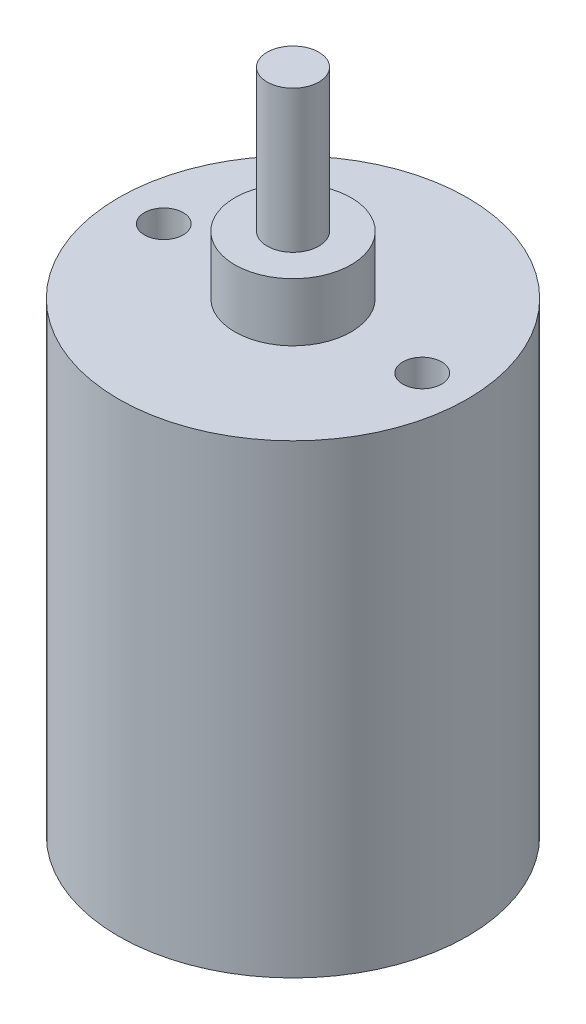
ISO-10303-21;
HEADER;
FILE_DESCRIPTION(('STEP AP214'),'2;1');
FILE_NAME('part.step','',(''),(''),'','','');
FILE_SCHEMA(('AUTOMOTIVE_DESIGN { 1 0 10303 214 1 1 1 1 }'));
ENDSEC;
DATA;
#1=APPLICATION_CONTEXT('core data for automotive mechanical design processes');
#2=APPLICATION_PROTOCOL_DEFINITION('international standard','automotive_design',2000,#1);
#3=PRODUCT_CONTEXT('',#1,'mechanical');
#4=PRODUCT('Part','Part','',(#3));
#5=PRODUCT_RELATED_PRODUCT_CATEGORY('part','',(#4));
#6=PRODUCT_DEFINITION_FORMATION('','',#4);
#7=PRODUCT_DEFINITION_CONTEXT('part definition',#1,'design');
#8=PRODUCT_DEFINITION('design','',#6,#7);
#9=PRODUCT_DEFINITION_SHAPE('','',#8);
#10=(LENGTH_UNIT() NAMED_UNIT(*) SI_UNIT(.MILLI.,.METRE.));
#11=(NAMED_UNIT(*) PLANE_ANGLE_UNIT() SI_UNIT($,.RADIAN.));
#12=(NAMED_UNIT(*) SI_UNIT($,.STERADIAN.) SOLID_ANGLE_UNIT());
#13=UNCERTAINTY_MEASURE_WITH_UNIT(LENGTH_MEASURE(1.E-05),#10,'distance_accuracy_value','');
#14=(GEOMETRIC_REPRESENTATION_CONTEXT(3) GLOBAL_UNCERTAINTY_ASSIGNED_CONTEXT((#13)) GLOBAL_UNIT_ASSIGNED_CONTEXT((#10,
#11,#12)) REPRESENTATION_CONTEXT('',''));
#15=CARTESIAN_POINT('',(0.,0.,0.));
#16=DIRECTION('',(0.,0.,1.));
#17=DIRECTION('',(1.,0.,0.));
#18=AXIS2_PLACEMENT_3D('',#15,#16,#17);
#19=CARTESIAN_POINT('',(0.,41.5,0.));
#20=DIRECTION('',(0.,1.,0.));
#21=DIRECTION('',(0.,0.,1.));
#22=AXIS2_PLACEMENT_3D('',#19,#20,#21);
#23=PLANE('',#22);
#24=CARTESIAN_POINT('',(0.,41.5,0.));
#25=DIRECTION('',(0.,1.,0.));
#26=DIRECTION('',(0.,0.,1.));
#27=AXIS2_PLACEMENT_3D('',#24,#25,#26);
#28=CIRCLE('',#27,4.5);
#29=CARTESIAN_POINT('',(0.,41.5,4.5));
#30=VERTEX_POINT('',#29);
#31=EDGE_CURVE('E45',#30,#30,#28,.T.);
#32=ORIENTED_EDGE('',*,*,#31,.T.);
#33=EDGE_LOOP('',(#32));
#34=FACE_BOUND('',#33,.T.);
#35=CARTESIAN_POINT('',(0.,41.5,0.));
#36=DIRECTION('',(0.,1.,0.));
#37=DIRECTION('',(0.,0.,1.));
#38=AXIS2_PLACEMENT_3D('',#35,#36,#37);
#39=CIRCLE('',#38,2.);
#40=CARTESIAN_POINT('',(0.,41.5,2.));
#41=VERTEX_POINT('',#40);
#42=EDGE_CURVE('E54',#41,#41,#39,.T.);
#43=ORIENTED_EDGE('',*,*,#42,.F.);
#44=EDGE_LOOP('',(#43));
#45=FACE_BOUND('',#44,.T.);
#46=ADVANCED_FACE('F29',(#34,#45),#23,.T.);
#47=CARTESIAN_POINT('',(0.,37.,0.));
#48=DIRECTION('',(0.,1.,0.));
#49=DIRECTION('',(0.,0.,1.));
#50=AXIS2_PLACEMENT_3D('',#47,#48,#49);
#51=PLANE('',#50);
#52=CARTESIAN_POINT('',(-10.,37.,0.));
#53=DIRECTION('',(0.,1.,0.));
#54=DIRECTION('',(0.,0.,1.));
#55=AXIS2_PLACEMENT_3D('',#52,#53,#54);
#56=CIRCLE('',#55,1.5);
#57=CARTESIAN_POINT('',(-10.,37.,1.5));
#58=VERTEX_POINT('',#57);
#59=EDGE_CURVE('E66',#58,#58,#56,.T.);
#60=ORIENTED_EDGE('',*,*,#59,.F.);
#61=EDGE_LOOP('',(#60));
#62=FACE_BOUND('',#61,.T.);
#63=CARTESIAN_POINT('',(10.,37.,0.));
#64=DIRECTION('',(0.,1.,0.));
#65=DIRECTION('',(0.,0.,1.));
#66=AXIS2_PLACEMENT_3D('',#63,#64,#65);
#67=CIRCLE('',#66,1.5);
#68=CARTESIAN_POINT('',(10.,37.,1.5));
#69=VERTEX_POINT('',#68);
#70=EDGE_CURVE('E60',#69,#69,#67,.T.);
#71=ORIENTED_EDGE('',*,*,#70,.F.);
#72=EDGE_LOOP('',(#71));
#73=FACE_BOUND('',#72,.T.);
#74=CARTESIAN_POINT('',(0.,37.,0.));
#75=DIRECTION('',(0.,1.,0.));
#76=DIRECTION('',(0.,0.,1.));
#77=AXIS2_PLACEMENT_3D('',#74,#75,#76);
#78=CIRCLE('',#77,13.5);
#79=CARTESIAN_POINT('',(0.,37.,13.5));
#80=VERTEX_POINT('',#79);
#81=EDGE_CURVE('E40',#80,#80,#78,.T.);
#82=ORIENTED_EDGE('',*,*,#81,.T.);
#83=EDGE_LOOP('',(#82));
#84=FACE_BOUND('',#83,.T.);
#85=CARTESIAN_POINT('',(0.,37.,0.));
#86=DIRECTION('',(0.,1.,0.));
#87=DIRECTION('',(0.,0.,1.));
#88=AXIS2_PLACEMENT_3D('',#85,#86,#87);
#89=CIRCLE('',#88,4.5);
#90=CARTESIAN_POINT('',(0.,37.,4.5));
#91=VERTEX_POINT('',#90);
#92=EDGE_CURVE('E48',#91,#91,#89,.T.);
#93=ORIENTED_EDGE('',*,*,#92,.F.);
#94=EDGE_LOOP('',(#93));
#95=FACE_BOUND('',#94,.T.);
#96=ADVANCED_FACE('F81',(#62,#73,#84,#95),#51,.T.);
#97=CARTESIAN_POINT('',(0.,1.,0.));
#98=DIRECTION('',(0.,-1.,0.));
#99=DIRECTION('',(0.,0.,-1.));
#100=AXIS2_PLACEMENT_3D('',#97,#98,#99);
#101=CYLINDRICAL_SURFACE('',#100,4.25);
#102=CARTESIAN_POINT('',(0.,1.,0.));
#103=DIRECTION('',(0.,1.,0.));
#104=DIRECTION('',(0.,0.,1.));
#105=AXIS2_PLACEMENT_3D('',#102,#103,#104);
#106=CIRCLE('',#105,4.25);
#107=CARTESIAN_POINT('',(0.,1.,4.25));
#108=VERTEX_POINT('',#107);
#109=EDGE_CURVE('E10',#108,#108,#106,.T.);
#110=ORIENTED_EDGE('',*,*,#109,.F.);
#111=EDGE_LOOP('',(#110));
#112=FACE_BOUND('',#111,.T.);
#113=CARTESIAN_POINT('',(0.,0.,0.));
#114=DIRECTION('',(0.,1.,0.));
#115=DIRECTION('',(0.,0.,1.));
#116=AXIS2_PLACEMENT_3D('',#113,#114,#115);
#117=CIRCLE('',#116,4.25);
#118=CARTESIAN_POINT('',(0.,0.,4.25));
#119=VERTEX_POINT('',#118);
#120=EDGE_CURVE('E33',#119,#119,#117,.T.);
#121=ORIENTED_EDGE('',*,*,#120,.T.);
#122=EDGE_LOOP('',(#121));
#123=FACE_BOUND('',#122,.T.);
#124=ADVANCED_FACE('F31',(#112,#123),#101,.T.);
#125=CARTESIAN_POINT('',(0.,0.,0.));
#126=DIRECTION('',(0.,1.,0.));
#127=DIRECTION('',(0.,0.,1.));
#128=AXIS2_PLACEMENT_3D('',#125,#126,#127);
#129=PLANE('',#128);
#130=ORIENTED_EDGE('',*,*,#120,.F.);
#131=EDGE_LOOP('',(#130));
#132=FACE_BOUND('',#131,.T.);
#133=ADVANCED_FACE('F173',(#132),#129,.F.);
#134=CARTESIAN_POINT('',(0.,1.,0.));
#135=DIRECTION('',(0.,1.,0.));
#136=DIRECTION('',(0.,0.,1.));
#137=AXIS2_PLACEMENT_3D('',#134,#135,#136);
#138=PLANE('',#137);
#139=CARTESIAN_POINT('',(0.,1.,0.));
#140=DIRECTION('',(0.,1.,0.));
#141=DIRECTION('',(0.,0.,1.));
#142=AXIS2_PLACEMENT_3D('',#139,#140,#141);
#143=CIRCLE('',#142,13.5);
#144=CARTESIAN_POINT('',(0.,1.,13.5));
#145=VERTEX_POINT('',#144);
#146=EDGE_CURVE('E42',#145,#145,#143,.T.);
#147=ORIENTED_EDGE('',*,*,#146,.F.);
#148=EDGE_LOOP('',(#147));
#149=FACE_BOUND('',#148,.T.);
#150=ORIENTED_EDGE('',*,*,#109,.T.);
#151=EDGE_LOOP('',(#150));
#152=FACE_BOUND('',#151,.T.);
#153=ADVANCED_FACE('F104',(#149,#152),#138,.F.);
#154=CARTESIAN_POINT('',(0.,37.,0.));
#155=DIRECTION('',(0.,-1.,0.));
#156=DIRECTION('',(0.,0.,-1.));
#157=AXIS2_PLACEMENT_3D('',#154,#155,#156);
#158=CYLINDRICAL_SURFACE('',#157,13.5);
#159=ORIENTED_EDGE('',*,*,#81,.F.);
#160=EDGE_LOOP('',(#159));
#161=FACE_BOUND('',#160,.T.);
#162=ORIENTED_EDGE('',*,*,#146,.T.);
#163=EDGE_LOOP('',(#162));
#164=FACE_BOUND('',#163,.T.);
#165=ADVANCED_FACE('F94',(#161,#164),#158,.T.);
#166=CARTESIAN_POINT('',(0.,41.5,0.));
#167=DIRECTION('',(0.,-1.,0.));
#168=DIRECTION('',(0.,0.,-1.));
#169=AXIS2_PLACEMENT_3D('',#166,#167,#168);
#170=CYLINDRICAL_SURFACE('',#169,4.5);
#171=ORIENTED_EDGE('',*,*,#31,.F.);
#172=EDGE_LOOP('',(#171));
#173=FACE_BOUND('',#172,.T.);
#174=ORIENTED_EDGE('',*,*,#92,.T.);
#175=EDGE_LOOP('',(#174));
#176=FACE_BOUND('',#175,.T.);
#177=ADVANCED_FACE('F91',(#173,#176),#170,.T.);
#178=CARTESIAN_POINT('',(0.,52.5,0.));
#179=DIRECTION('',(0.,-1.,0.));
#180=DIRECTION('',(0.,0.,-1.));
#181=AXIS2_PLACEMENT_3D('',#178,#179,#180);
#182=CYLINDRICAL_SURFACE('',#181,2.);
#183=CARTESIAN_POINT('',(0.,52.5,0.));
#184=DIRECTION('',(0.,1.,0.));
#185=DIRECTION('',(0.,0.,1.));
#186=AXIS2_PLACEMENT_3D('',#183,#184,#185);
#187=CIRCLE('',#186,2.);
#188=CARTESIAN_POINT('',(0.,52.5,2.));
#189=VERTEX_POINT('',#188);
#190=EDGE_CURVE('E51',#189,#189,#187,.T.);
#191=ORIENTED_EDGE('',*,*,#190,.F.);
#192=EDGE_LOOP('',(#191));
#193=FACE_BOUND('',#192,.T.);
#194=ORIENTED_EDGE('',*,*,#42,.T.);
#195=EDGE_LOOP('',(#194));
#196=FACE_BOUND('',#195,.T.);
#197=ADVANCED_FACE('F93',(#193,#196),#182,.T.);
#198=CARTESIAN_POINT('',(0.,52.5,0.));
#199=DIRECTION('',(0.,1.,0.));
#200=DIRECTION('',(0.,0.,1.));
#201=AXIS2_PLACEMENT_3D('',#198,#199,#200);
#202=PLANE('',#201);
#203=ORIENTED_EDGE('',*,*,#190,.T.);
#204=EDGE_LOOP('',(#203));
#205=FACE_BOUND('',#204,.T.);
#206=ADVANCED_FACE('F101',(#205),#202,.T.);
#207=CARTESIAN_POINT('',(10.,33.,0.));
#208=DIRECTION('',(0.,1.,0.));
#209=DIRECTION('',(0.,0.,1.));
#210=AXIS2_PLACEMENT_3D('',#207,#208,#209);
#211=CYLINDRICAL_SURFACE('',#210,1.5);
#212=CARTESIAN_POINT('',(10.,33.,0.));
#213=DIRECTION('',(0.,1.,0.));
#214=DIRECTION('',(0.,0.,1.));
#215=AXIS2_PLACEMENT_3D('',#212,#213,#214);
#216=CIRCLE('',#215,1.5);
#217=CARTESIAN_POINT('',(10.,33.,1.5));
#218=VERTEX_POINT('',#217);
#219=EDGE_CURVE('E57',#218,#218,#216,.T.);
#220=ORIENTED_EDGE('',*,*,#219,.F.);
#221=EDGE_LOOP('',(#220));
#222=FACE_BOUND('',#221,.T.);
#223=ORIENTED_EDGE('',*,*,#70,.T.);
#224=EDGE_LOOP('',(#223));
#225=FACE_BOUND('',#224,.T.);
#226=ADVANCED_FACE('F117',(#222,#225),#211,.F.);
#227=CARTESIAN_POINT('',(10.,33.,0.));
#228=DIRECTION('',(0.,1.,0.));
#229=DIRECTION('',(0.,0.,1.));
#230=AXIS2_PLACEMENT_3D('',#227,#228,#229);
#231=PLANE('',#230);
#232=ORIENTED_EDGE('',*,*,#219,.T.);
#233=EDGE_LOOP('',(#232));
#234=FACE_BOUND('',#233,.T.);
#235=ADVANCED_FACE('F77',(#234),#231,.T.);
#236=CARTESIAN_POINT('',(-10.,33.,0.));
#237=DIRECTION('',(0.,1.,0.));
#238=DIRECTION('',(0.,0.,1.));
#239=AXIS2_PLACEMENT_3D('',#236,#237,#238);
#240=CYLINDRICAL_SURFACE('',#239,1.5);
#241=CARTESIAN_POINT('',(-10.,33.,0.));
#242=DIRECTION('',(0.,1.,0.));
#243=DIRECTION('',(0.,0.,1.));
#244=AXIS2_PLACEMENT_3D('',#241,#242,#243);
#245=CIRCLE('',#244,1.5);
#246=CARTESIAN_POINT('',(-10.,33.,1.5));
#247=VERTEX_POINT('',#246);
#248=EDGE_CURVE('E63',#247,#247,#245,.T.);
#249=ORIENTED_EDGE('',*,*,#248,.F.);
#250=EDGE_LOOP('',(#249));
#251=FACE_BOUND('',#250,.T.);
#252=ORIENTED_EDGE('',*,*,#59,.T.);
#253=EDGE_LOOP('',(#252));
#254=FACE_BOUND('',#253,.T.);
#255=ADVANCED_FACE('F74',(#251,#254),#240,.F.);
#256=CARTESIAN_POINT('',(-10.,33.,0.));
#257=DIRECTION('',(0.,1.,0.));
#258=DIRECTION('',(0.,0.,1.));
#259=AXIS2_PLACEMENT_3D('',#256,#257,#258);
#260=PLANE('',#259);
#261=ORIENTED_EDGE('',*,*,#248,.T.);
#262=EDGE_LOOP('',(#261));
#263=FACE_BOUND('',#262,.T.);
#264=ADVANCED_FACE('F72',(#263),#260,.T.);
#265=CLOSED_SHELL('',(#46,#96,#124,#133,#153,#165,#177,#197,#206,#226,#235,#255,#264));
#266=MANIFOLD_SOLID_BREP('B2',#265);
#267=ADVANCED_BREP_SHAPE_REPRESENTATION('',(#18,#266),#14);
#268=SHAPE_DEFINITION_REPRESENTATION(#9,#267);
ENDSEC;
END-ISO-10303-21;
